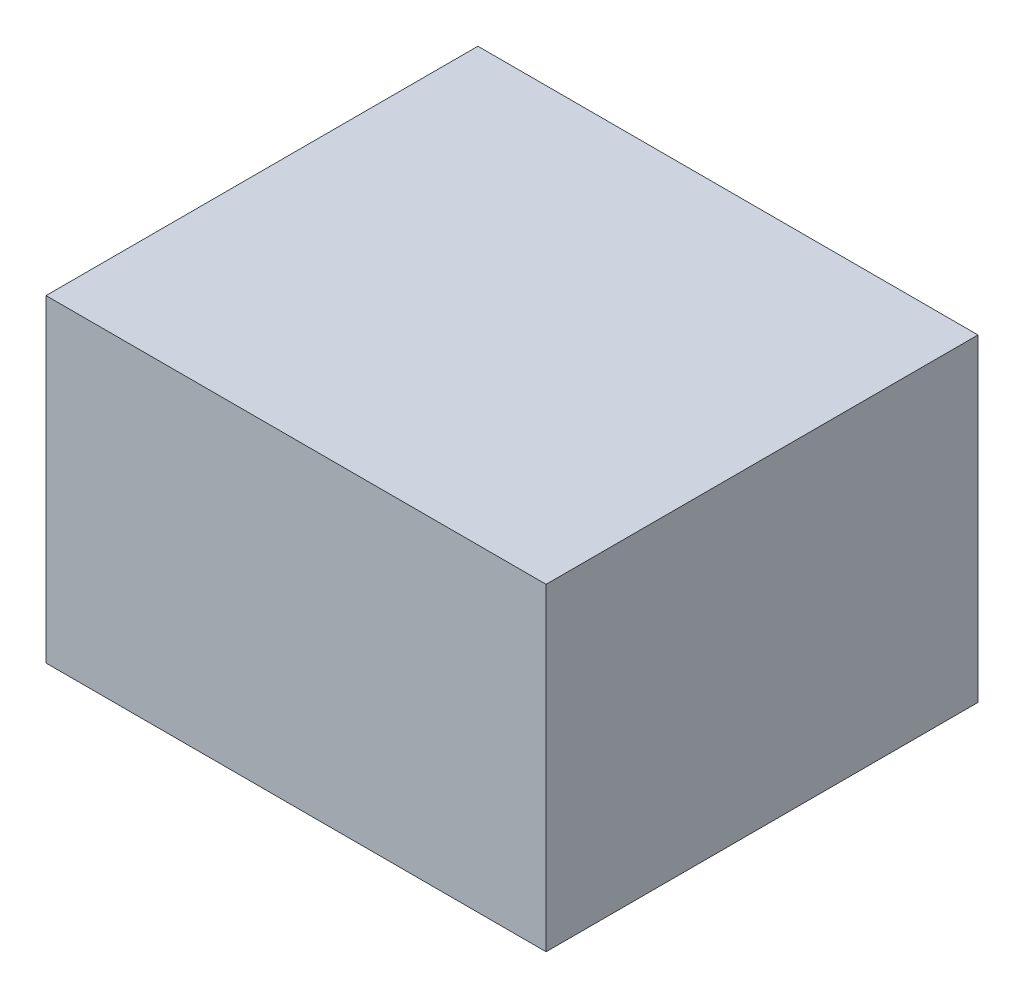
ISO-10303-21;
HEADER;
FILE_DESCRIPTION(('STEP AP214'),'2;1');
FILE_NAME('part.step','',(''),(''),'','','');
FILE_SCHEMA(('AUTOMOTIVE_DESIGN { 1 0 10303 214 1 1 1 1 }'));
ENDSEC;
DATA;
#1=APPLICATION_CONTEXT('core data for automotive mechanical design processes');
#2=APPLICATION_PROTOCOL_DEFINITION('international standard','automotive_design',2000,#1);
#3=PRODUCT_CONTEXT('',#1,'mechanical');
#4=PRODUCT('Part','Part','',(#3));
#5=PRODUCT_RELATED_PRODUCT_CATEGORY('part','',(#4));
#6=PRODUCT_DEFINITION_FORMATION('','',#4);
#7=PRODUCT_DEFINITION_CONTEXT('part definition',#1,'design');
#8=PRODUCT_DEFINITION('design','',#6,#7);
#9=PRODUCT_DEFINITION_SHAPE('','',#8);
#10=(LENGTH_UNIT() NAMED_UNIT(*) SI_UNIT(.MILLI.,.METRE.));
#11=(NAMED_UNIT(*) PLANE_ANGLE_UNIT() SI_UNIT($,.RADIAN.));
#12=(NAMED_UNIT(*) SI_UNIT($,.STERADIAN.) SOLID_ANGLE_UNIT());
#13=UNCERTAINTY_MEASURE_WITH_UNIT(LENGTH_MEASURE(1.E-05),#10,'distance_accuracy_value','');
#14=(GEOMETRIC_REPRESENTATION_CONTEXT(3) GLOBAL_UNCERTAINTY_ASSIGNED_CONTEXT((#13)) GLOBAL_UNIT_ASSIGNED_CONTEXT((#10,
#11,#12)) REPRESENTATION_CONTEXT('',''));
#15=CARTESIAN_POINT('',(0.,0.,0.));
#16=DIRECTION('',(0.,0.,1.));
#17=DIRECTION('',(1.,0.,0.));
#18=AXIS2_PLACEMENT_3D('',#15,#16,#17);
#19=CARTESIAN_POINT('',(-2.2,1.4,3.8));
#20=DIRECTION('',(1.,0.,0.));
#21=DIRECTION('',(0.,1.,0.));
#22=AXIS2_PLACEMENT_3D('',#19,#20,#21);
#23=PLANE('',#22);
#24=DIRECTION('',(0.,-1.,0.));
#25=VECTOR('',#24,1.);
#26=CARTESIAN_POINT('',(-2.2,1.4,0.));
#27=LINE('',#26,#25);
#28=CARTESIAN_POINT('',(-2.2,1.4,0.));
#29=VERTEX_POINT('',#28);
#30=CARTESIAN_POINT('',(-2.2,-1.4,0.));
#31=VERTEX_POINT('',#30);
#32=EDGE_CURVE('E100',#29,#31,#27,.T.);
#33=ORIENTED_EDGE('',*,*,#32,.T.);
#34=DIRECTION('',(0.,0.,-1.));
#35=VECTOR('',#34,1.);
#36=CARTESIAN_POINT('',(-2.2,-1.4,3.8));
#37=LINE('',#36,#35);
#38=CARTESIAN_POINT('',(-2.2,-1.4,3.8));
#39=VERTEX_POINT('',#38);
#40=EDGE_CURVE('E11',#39,#31,#37,.T.);
#41=ORIENTED_EDGE('',*,*,#40,.F.);
#42=DIRECTION('',(0.,-1.,0.));
#43=VECTOR('',#42,1.);
#44=CARTESIAN_POINT('',(-2.2,1.4,3.8));
#45=LINE('',#44,#43);
#46=CARTESIAN_POINT('',(-2.2,1.4,3.8));
#47=VERTEX_POINT('',#46);
#48=EDGE_CURVE('E88',#47,#39,#45,.T.);
#49=ORIENTED_EDGE('',*,*,#48,.F.);
#50=DIRECTION('',(0.,0.,-1.));
#51=VECTOR('',#50,1.);
#52=CARTESIAN_POINT('',(-2.2,1.4,3.8));
#53=LINE('',#52,#51);
#54=EDGE_CURVE('E96',#47,#29,#53,.T.);
#55=ORIENTED_EDGE('',*,*,#54,.T.);
#56=EDGE_LOOP('',(#33,#41,#49,#55));
#57=FACE_BOUND('',#56,.T.);
#58=ADVANCED_FACE('F37',(#57),#23,.F.);
#59=CARTESIAN_POINT('',(-2.2,-1.4,3.8));
#60=DIRECTION('',(0.,1.,0.));
#61=DIRECTION('',(0.,0.,1.));
#62=AXIS2_PLACEMENT_3D('',#59,#60,#61);
#63=PLANE('',#62);
#64=DIRECTION('',(1.,0.,0.));
#65=VECTOR('',#64,1.);
#66=CARTESIAN_POINT('',(-2.2,-1.4,0.));
#67=LINE('',#66,#65);
#68=CARTESIAN_POINT('',(2.2,-1.4,0.));
#69=VERTEX_POINT('',#68);
#70=EDGE_CURVE('E92',#31,#69,#67,.T.);
#71=ORIENTED_EDGE('',*,*,#70,.T.);
#72=DIRECTION('',(0.,0.,-1.));
#73=VECTOR('',#72,1.);
#74=CARTESIAN_POINT('',(2.2,-1.4,3.8));
#75=LINE('',#74,#73);
#76=CARTESIAN_POINT('',(2.2,-1.4,3.8));
#77=VERTEX_POINT('',#76);
#78=EDGE_CURVE('E45',#77,#69,#75,.T.);
#79=ORIENTED_EDGE('',*,*,#78,.F.);
#80=DIRECTION('',(1.,0.,0.));
#81=VECTOR('',#80,1.);
#82=CARTESIAN_POINT('',(-2.2,-1.4,3.8));
#83=LINE('',#82,#81);
#84=EDGE_CURVE('E83',#39,#77,#83,.T.);
#85=ORIENTED_EDGE('',*,*,#84,.F.);
#86=ORIENTED_EDGE('',*,*,#40,.T.);
#87=EDGE_LOOP('',(#71,#79,#85,#86));
#88=FACE_BOUND('',#87,.T.);
#89=ADVANCED_FACE('F91',(#88),#63,.F.);
#90=CARTESIAN_POINT('',(2.2,1.4,3.8));
#91=DIRECTION('',(-1.,0.,0.));
#92=DIRECTION('',(0.,-1.,0.));
#93=AXIS2_PLACEMENT_3D('',#90,#91,#92);
#94=PLANE('',#93);
#95=DIRECTION('',(0.,1.,0.));
#96=VECTOR('',#95,1.);
#97=CARTESIAN_POINT('',(2.2,1.4,0.));
#98=LINE('',#97,#96);
#99=CARTESIAN_POINT('',(2.2,1.4,0.));
#100=VERTEX_POINT('',#99);
#101=EDGE_CURVE('E70',#69,#100,#98,.T.);
#102=ORIENTED_EDGE('',*,*,#101,.T.);
#103=DIRECTION('',(0.,0.,-1.));
#104=VECTOR('',#103,1.);
#105=CARTESIAN_POINT('',(2.2,1.4,3.8));
#106=LINE('',#105,#104);
#107=CARTESIAN_POINT('',(2.2,1.4,3.8));
#108=VERTEX_POINT('',#107);
#109=EDGE_CURVE('E93',#108,#100,#106,.T.);
#110=ORIENTED_EDGE('',*,*,#109,.F.);
#111=DIRECTION('',(0.,1.,0.));
#112=VECTOR('',#111,1.);
#113=CARTESIAN_POINT('',(2.2,1.4,3.8));
#114=LINE('',#113,#112);
#115=EDGE_CURVE('E86',#77,#108,#114,.T.);
#116=ORIENTED_EDGE('',*,*,#115,.F.);
#117=ORIENTED_EDGE('',*,*,#78,.T.);
#118=EDGE_LOOP('',(#102,#110,#116,#117));
#119=FACE_BOUND('',#118,.T.);
#120=ADVANCED_FACE('F94',(#119),#94,.F.);
#121=CARTESIAN_POINT('',(-2.2,1.4,3.8));
#122=DIRECTION('',(0.,-1.,0.));
#123=DIRECTION('',(0.,0.,-1.));
#124=AXIS2_PLACEMENT_3D('',#121,#122,#123);
#125=PLANE('',#124);
#126=DIRECTION('',(-1.,0.,0.));
#127=VECTOR('',#126,1.);
#128=CARTESIAN_POINT('',(-2.2,1.4,0.));
#129=LINE('',#128,#127);
#130=EDGE_CURVE('E76',#100,#29,#129,.T.);
#131=ORIENTED_EDGE('',*,*,#130,.T.);
#132=ORIENTED_EDGE('',*,*,#54,.F.);
#133=DIRECTION('',(-1.,0.,0.));
#134=VECTOR('',#133,1.);
#135=CARTESIAN_POINT('',(-2.2,1.4,3.8));
#136=LINE('',#135,#134);
#137=EDGE_CURVE('E53',#108,#47,#136,.T.);
#138=ORIENTED_EDGE('',*,*,#137,.F.);
#139=ORIENTED_EDGE('',*,*,#109,.T.);
#140=EDGE_LOOP('',(#131,#132,#138,#139));
#141=FACE_BOUND('',#140,.T.);
#142=ADVANCED_FACE('F107',(#141),#125,.F.);
#143=CARTESIAN_POINT('',(0.,0.,3.8));
#144=DIRECTION('',(0.,0.,1.));
#145=DIRECTION('',(1.,0.,0.));
#146=AXIS2_PLACEMENT_3D('',#143,#144,#145);
#147=PLANE('',#146);
#148=ORIENTED_EDGE('',*,*,#48,.T.);
#149=ORIENTED_EDGE('',*,*,#84,.T.);
#150=ORIENTED_EDGE('',*,*,#115,.T.);
#151=ORIENTED_EDGE('',*,*,#137,.T.);
#152=EDGE_LOOP('',(#148,#149,#150,#151));
#153=FACE_BOUND('',#152,.T.);
#154=ADVANCED_FACE('F84',(#153),#147,.T.);
#155=CARTESIAN_POINT('',(0.,0.,0.));
#156=DIRECTION('',(0.,0.,1.));
#157=DIRECTION('',(1.,0.,0.));
#158=AXIS2_PLACEMENT_3D('',#155,#156,#157);
#159=PLANE('',#158);
#160=ORIENTED_EDGE('',*,*,#32,.F.);
#161=ORIENTED_EDGE('',*,*,#130,.F.);
#162=ORIENTED_EDGE('',*,*,#101,.F.);
#163=ORIENTED_EDGE('',*,*,#70,.F.);
#164=EDGE_LOOP('',(#160,#161,#162,#163));
#165=FACE_BOUND('',#164,.T.);
#166=ADVANCED_FACE('F110',(#165),#159,.F.);
#167=CLOSED_SHELL('',(#58,#89,#120,#142,#154,#166));
#168=MANIFOLD_SOLID_BREP('B2',#167);
#169=ADVANCED_BREP_SHAPE_REPRESENTATION('',(#18,#168),#14);
#170=SHAPE_DEFINITION_REPRESENTATION(#9,#169);
ENDSEC;
END-ISO-10303-21;
